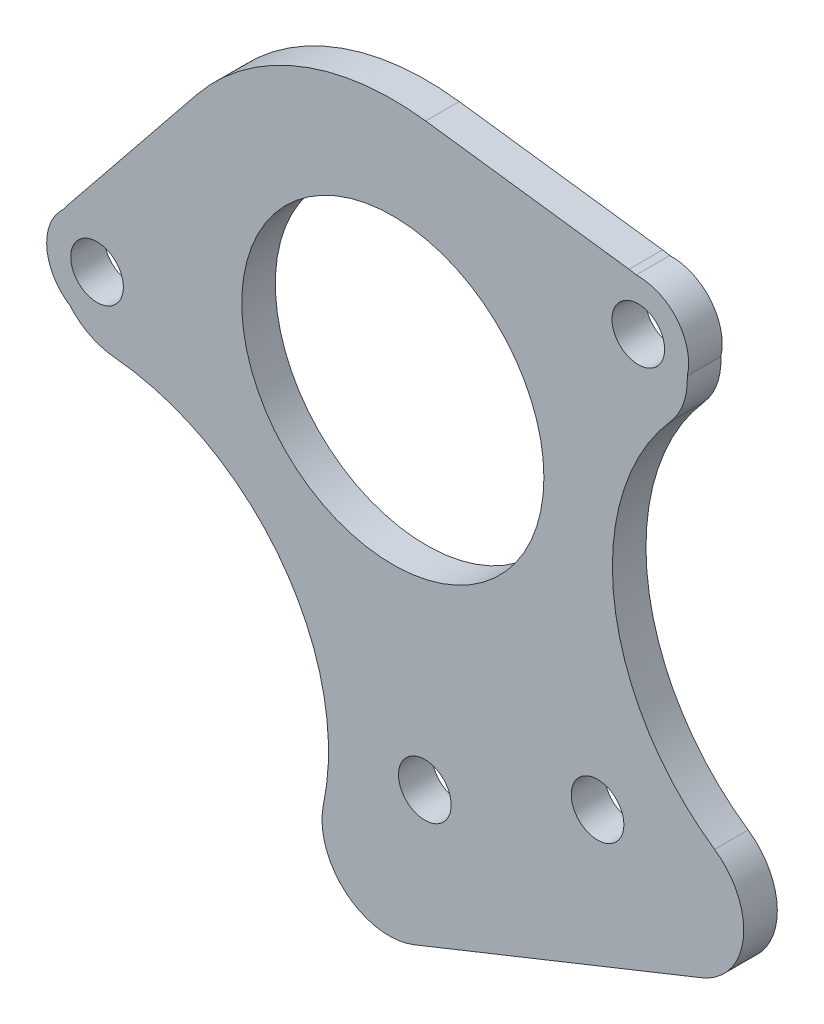
ISO-10303-21;
HEADER;
FILE_DESCRIPTION(('STEP AP214'),'2;1');
FILE_NAME('part.step','',(''),(''),'','','');
FILE_SCHEMA(('AUTOMOTIVE_DESIGN { 1 0 10303 214 1 1 1 1 }'));
ENDSEC;
DATA;
#1=APPLICATION_CONTEXT('core data for automotive mechanical design processes');
#2=APPLICATION_PROTOCOL_DEFINITION('international standard','automotive_design',2000,#1);
#3=PRODUCT_CONTEXT('',#1,'mechanical');
#4=PRODUCT('Part','Part','',(#3));
#5=PRODUCT_RELATED_PRODUCT_CATEGORY('part','',(#4));
#6=PRODUCT_DEFINITION_FORMATION('','',#4);
#7=PRODUCT_DEFINITION_CONTEXT('part definition',#1,'design');
#8=PRODUCT_DEFINITION('design','',#6,#7);
#9=PRODUCT_DEFINITION_SHAPE('','',#8);
#10=(LENGTH_UNIT() NAMED_UNIT(*) SI_UNIT(.MILLI.,.METRE.));
#11=(NAMED_UNIT(*) PLANE_ANGLE_UNIT() SI_UNIT($,.RADIAN.));
#12=(NAMED_UNIT(*) SI_UNIT($,.STERADIAN.) SOLID_ANGLE_UNIT());
#13=UNCERTAINTY_MEASURE_WITH_UNIT(LENGTH_MEASURE(1.E-05),#10,'distance_accuracy_value','');
#14=(GEOMETRIC_REPRESENTATION_CONTEXT(3) GLOBAL_UNCERTAINTY_ASSIGNED_CONTEXT((#13)) GLOBAL_UNIT_ASSIGNED_CONTEXT((#10,
#11,#12)) REPRESENTATION_CONTEXT('',''));
#15=CARTESIAN_POINT('',(0.,0.,0.));
#16=DIRECTION('',(0.,0.,1.));
#17=DIRECTION('',(1.,0.,0.));
#18=AXIS2_PLACEMENT_3D('',#15,#16,#17);
#19=CARTESIAN_POINT('',(239.222352264285,614.530885279437,3.175));
#20=DIRECTION('',(0.,0.,-1.));
#21=DIRECTION('',(-1.,0.,0.));
#22=AXIS2_PLACEMENT_3D('',#19,#20,#21);
#23=CYLINDRICAL_SURFACE('',#22,6.35);
#24=DIRECTION('',(0.,0.,1.));
#25=VECTOR('',#24,1.);
#26=CARTESIAN_POINT('',(233.869493700879,617.946936391493,1.5875));
#27=LINE('',#26,#25);
#28=CARTESIAN_POINT('',(233.869493700879,617.946936391493,3.175));
#29=VERTEX_POINT('',#28);
#30=CARTESIAN_POINT('',(233.869493700879,617.946936391493,0.));
#31=VERTEX_POINT('',#30);
#32=EDGE_CURVE('E11',#29,#31,#27,.F.);
#33=ORIENTED_EDGE('',*,*,#32,.F.);
#34=CARTESIAN_POINT('',(239.222352264285,614.530885279437,3.175));
#35=DIRECTION('',(0.,0.,1.));
#36=DIRECTION('',(1.,0.,0.));
#37=AXIS2_PLACEMENT_3D('',#34,#35,#36);
#38=CIRCLE('',#37,6.35);
#39=CARTESIAN_POINT('',(234.277101216712,618.514224591683,3.175));
#40=VERTEX_POINT('',#39);
#41=EDGE_CURVE('E172',#40,#29,#38,.T.);
#42=ORIENTED_EDGE('',*,*,#41,.F.);
#43=DIRECTION('',(0.,0.,1.));
#44=VECTOR('',#43,1.);
#45=CARTESIAN_POINT('',(234.277101216712,618.514224591683,3.175));
#46=LINE('',#45,#44);
#47=CARTESIAN_POINT('',(234.277101216712,618.514224591683,0.));
#48=VERTEX_POINT('',#47);
#49=EDGE_CURVE('E156',#48,#40,#46,.T.);
#50=ORIENTED_EDGE('',*,*,#49,.F.);
#51=CARTESIAN_POINT('',(239.222352264285,614.530885279437,0.));
#52=DIRECTION('',(0.,0.,1.));
#53=DIRECTION('',(1.,0.,0.));
#54=AXIS2_PLACEMENT_3D('',#51,#52,#53);
#55=CIRCLE('',#54,6.35);
#56=EDGE_CURVE('E157',#31,#48,#55,.F.);
#57=ORIENTED_EDGE('',*,*,#56,.F.);
#58=EDGE_LOOP('',(#33,#42,#50,#57));
#59=FACE_BOUND('',#58,.T.);
#60=ADVANCED_FACE('F39',(#59),#23,.T.);
#61=CARTESIAN_POINT('',(286.488706124676,633.463029384333,3.175));
#62=DIRECTION('',(0.,0.,-1.));
#63=DIRECTION('',(-1.,0.,0.));
#64=AXIS2_PLACEMENT_3D('',#61,#62,#63);
#65=CYLINDRICAL_SURFACE('',#64,6.35);
#66=DIRECTION('',(0.,0.,1.));
#67=VECTOR('',#66,1.);
#68=CARTESIAN_POINT('',(292.831348836054,633.768616419062,1.5875));
#69=LINE('',#68,#67);
#70=CARTESIAN_POINT('',(292.831348836054,633.768616419062,3.175));
#71=VERTEX_POINT('',#70);
#72=CARTESIAN_POINT('',(292.831348836054,633.768616419062,0.));
#73=VERTEX_POINT('',#72);
#74=EDGE_CURVE('E150',#71,#73,#69,.F.);
#75=ORIENTED_EDGE('',*,*,#74,.F.);
#76=CARTESIAN_POINT('',(286.488706124676,633.463029384333,3.175));
#77=DIRECTION('',(0.,0.,1.));
#78=DIRECTION('',(1.,0.,0.));
#79=AXIS2_PLACEMENT_3D('',#76,#77,#78);
#80=CIRCLE('',#79,6.35);
#81=CARTESIAN_POINT('',(291.263498924652,629.276879158015,3.175));
#82=VERTEX_POINT('',#81);
#83=EDGE_CURVE('E165',#82,#71,#80,.T.);
#84=ORIENTED_EDGE('',*,*,#83,.F.);
#85=DIRECTION('',(0.,0.,-1.));
#86=VECTOR('',#85,1.);
#87=CARTESIAN_POINT('',(291.263498924652,629.276879158015,3.175));
#88=LINE('',#87,#86);
#89=CARTESIAN_POINT('',(291.263498924652,629.276879158015,0.));
#90=VERTEX_POINT('',#89);
#91=EDGE_CURVE('E175',#90,#82,#88,.F.);
#92=ORIENTED_EDGE('',*,*,#91,.F.);
#93=CARTESIAN_POINT('',(286.488706124676,633.463029384333,0.));
#94=DIRECTION('',(0.,0.,1.));
#95=DIRECTION('',(1.,0.,0.));
#96=AXIS2_PLACEMENT_3D('',#93,#94,#95);
#97=CIRCLE('',#96,6.35);
#98=EDGE_CURVE('E200',#73,#90,#97,.F.);
#99=ORIENTED_EDGE('',*,*,#98,.F.);
#100=EDGE_LOOP('',(#75,#84,#92,#99));
#101=FACE_BOUND('',#100,.T.);
#102=ADVANCED_FACE('F201',(#101),#65,.T.);
#103=CARTESIAN_POINT('',(236.681188921527,586.069101887221,3.175));
#104=DIRECTION('',(0.,0.,-1.));
#105=DIRECTION('',(-1.,0.,0.));
#106=AXIS2_PLACEMENT_3D('',#103,#104,#105);
#107=CYLINDRICAL_SURFACE('',#106,22.225);
#108=CARTESIAN_POINT('',(236.681188921527,586.069101887221,3.175));
#109=DIRECTION('',(0.,0.,1.));
#110=DIRECTION('',(1.,0.,0.));
#111=AXIS2_PLACEMENT_3D('',#108,#109,#110);
#112=CIRCLE('',#111,22.225);
#113=CARTESIAN_POINT('',(258.426883586808,581.478307998974,3.175));
#114=VERTEX_POINT('',#113);
#115=CARTESIAN_POINT('',(238.657649299227,608.206044525611,3.175));
#116=VERTEX_POINT('',#115);
#117=EDGE_CURVE('E240',#114,#116,#112,.T.);
#118=ORIENTED_EDGE('',*,*,#117,.T.);
#119=DIRECTION('',(0.,0.,-1.));
#120=VECTOR('',#119,1.);
#121=CARTESIAN_POINT('',(238.657649299227,608.206044525611,3.175));
#122=LINE('',#121,#120);
#123=CARTESIAN_POINT('',(238.657649299227,608.206044525611,0.));
#124=VERTEX_POINT('',#123);
#125=EDGE_CURVE('E205',#116,#124,#122,.T.);
#126=ORIENTED_EDGE('',*,*,#125,.T.);
#127=CARTESIAN_POINT('',(236.681188921527,586.069101887221,0.));
#128=DIRECTION('',(0.,0.,1.));
#129=DIRECTION('',(1.,0.,0.));
#130=AXIS2_PLACEMENT_3D('',#127,#128,#129);
#131=CIRCLE('',#130,22.225);
#132=CARTESIAN_POINT('',(258.426883586808,581.478307998974,0.));
#133=VERTEX_POINT('',#132);
#134=EDGE_CURVE('E155',#133,#124,#131,.T.);
#135=ORIENTED_EDGE('',*,*,#134,.F.);
#136=DIRECTION('',(0.,0.,-1.));
#137=VECTOR('',#136,1.);
#138=CARTESIAN_POINT('',(258.426883586808,581.478307998974,3.175));
#139=LINE('',#138,#137);
#140=EDGE_CURVE('E208',#133,#114,#139,.F.);
#141=ORIENTED_EDGE('',*,*,#140,.T.);
#142=EDGE_LOOP('',(#118,#126,#135,#141));
#143=FACE_BOUND('',#142,.T.);
#144=ADVANCED_FACE('F296',(#143),#107,.F.);
#145=CARTESIAN_POINT('',(-161.305125926608,402.717469257513,3.175));
#146=DIRECTION('',(-0.371824109987117,0.928303200054965,0.));
#147=DIRECTION('',(-0.928303200054965,-0.371824109987117,0.));
#148=AXIS2_PLACEMENT_3D('',#145,#146,#147);
#149=PLANE('',#148);
#150=DIRECTION('',(0.928303200054965,0.371824109987117,0.));
#151=VECTOR('',#150,1.);
#152=CARTESIAN_POINT('',(-161.305125926608,402.717469257513,0.));
#153=LINE('',#152,#151);
#154=CARTESIAN_POINT('',(267.001022303878,574.271927281983,0.));
#155=VERTEX_POINT('',#154);
#156=CARTESIAN_POINT('',(294.183022031145,585.159450728701,0.));
#157=VERTEX_POINT('',#156);
#158=EDGE_CURVE('E213',#155,#157,#153,.T.);
#159=ORIENTED_EDGE('',*,*,#158,.T.);
#160=DIRECTION('',(0.,0.,1.));
#161=VECTOR('',#160,1.);
#162=CARTESIAN_POINT('',(294.183022031145,585.159450728701,3.175));
#163=LINE('',#162,#161);
#164=CARTESIAN_POINT('',(294.183022031145,585.159450728701,3.175));
#165=VERTEX_POINT('',#164);
#166=EDGE_CURVE('E183',#157,#165,#163,.T.);
#167=ORIENTED_EDGE('',*,*,#166,.T.);
#168=DIRECTION('',(0.928303200054965,0.371824109987117,0.));
#169=VECTOR('',#168,1.);
#170=CARTESIAN_POINT('',(-161.305125926608,402.717469257513,3.175));
#171=LINE('',#170,#169);
#172=CARTESIAN_POINT('',(267.001022303878,574.271927281983,3.175));
#173=VERTEX_POINT('',#172);
#174=EDGE_CURVE('E232',#173,#165,#171,.T.);
#175=ORIENTED_EDGE('',*,*,#174,.F.);
#176=DIRECTION('',(0.,0.,1.));
#177=VECTOR('',#176,1.);
#178=CARTESIAN_POINT('',(267.001022303878,574.271927281983,0.));
#179=LINE('',#178,#177);
#180=EDGE_CURVE('E180',#173,#155,#179,.F.);
#181=ORIENTED_EDGE('',*,*,#180,.T.);
#182=EDGE_LOOP('',(#159,#167,#175,#181));
#183=FACE_BOUND('',#182,.T.);
#184=ADVANCED_FACE('F219',(#183),#149,.F.);
#185=CARTESIAN_POINT('',(307.975273724569,614.625353365906,3.175));
#186=DIRECTION('',(0.,0.,-1.));
#187=DIRECTION('',(-1.,0.,0.));
#188=AXIS2_PLACEMENT_3D('',#185,#186,#187);
#189=CYLINDRICAL_SURFACE('',#188,22.225);
#190=CARTESIAN_POINT('',(307.975273724569,614.625353365906,3.175));
#191=DIRECTION('',(0.,0.,1.));
#192=DIRECTION('',(1.,0.,0.));
#193=AXIS2_PLACEMENT_3D('',#190,#191,#192);
#194=CIRCLE('',#193,22.225);
#195=CARTESIAN_POINT('',(295.41156888647,596.292215452795,3.175));
#196=VERTEX_POINT('',#195);
#197=EDGE_CURVE('E231',#82,#196,#194,.T.);
#198=ORIENTED_EDGE('',*,*,#197,.T.);
#199=DIRECTION('',(0.,0.,-1.));
#200=VECTOR('',#199,1.);
#201=CARTESIAN_POINT('',(295.41156888647,596.292215452795,3.175));
#202=LINE('',#201,#200);
#203=CARTESIAN_POINT('',(295.41156888647,596.292215452795,0.));
#204=VERTEX_POINT('',#203);
#205=EDGE_CURVE('E177',#196,#204,#202,.T.);
#206=ORIENTED_EDGE('',*,*,#205,.T.);
#207=CARTESIAN_POINT('',(307.975273724569,614.625353365906,0.));
#208=DIRECTION('',(0.,0.,1.));
#209=DIRECTION('',(1.,0.,0.));
#210=AXIS2_PLACEMENT_3D('',#207,#208,#209);
#211=CIRCLE('',#210,22.225);
#212=EDGE_CURVE('E214',#90,#204,#211,.T.);
#213=ORIENTED_EDGE('',*,*,#212,.F.);
#214=ORIENTED_EDGE('',*,*,#91,.T.);
#215=EDGE_LOOP('',(#198,#206,#213,#214));
#216=FACE_BOUND('',#215,.T.);
#217=ADVANCED_FACE('F234',(#216),#189,.F.);
#218=CARTESIAN_POINT('',(87.5972657903765,666.026359261334,3.175));
#219=DIRECTION('',(0.130399227174235,0.991461568368821,0.));
#220=DIRECTION('',(-0.991461568368821,0.130399227174235,0.));
#221=AXIS2_PLACEMENT_3D('',#218,#219,#220);
#222=PLANE('',#221);
#223=DIRECTION('',(0.991461568368821,-0.130399227174235,0.));
#224=VECTOR('',#223,1.);
#225=CARTESIAN_POINT('',(87.5972657903765,666.026359261334,3.175));
#226=LINE('',#225,#224);
#227=CARTESIAN_POINT('',(268.091028626586,642.287418757232,3.175));
#228=VERTEX_POINT('',#227);
#229=CARTESIAN_POINT('',(287.316741217232,639.758810343474,3.175));
#230=VERTEX_POINT('',#229);
#231=EDGE_CURVE('E235',#228,#230,#226,.T.);
#232=ORIENTED_EDGE('',*,*,#231,.T.);
#233=DIRECTION('',(0.,0.,-1.));
#234=VECTOR('',#233,1.);
#235=CARTESIAN_POINT('',(287.316741217232,639.758810343474,3.175));
#236=LINE('',#235,#234);
#237=CARTESIAN_POINT('',(287.316741217232,639.758810343474,0.));
#238=VERTEX_POINT('',#237);
#239=EDGE_CURVE('E185',#230,#238,#236,.T.);
#240=ORIENTED_EDGE('',*,*,#239,.T.);
#241=DIRECTION('',(0.991461568368821,-0.130399227174235,0.));
#242=VECTOR('',#241,1.);
#243=CARTESIAN_POINT('',(87.5972657903765,666.026359261334,0.));
#244=LINE('',#243,#242);
#245=CARTESIAN_POINT('',(268.091028626586,642.287418757232,0.));
#246=VERTEX_POINT('',#245);
#247=EDGE_CURVE('E267',#246,#238,#244,.T.);
#248=ORIENTED_EDGE('',*,*,#247,.F.);
#249=DIRECTION('',(0.,0.,-1.));
#250=VECTOR('',#249,1.);
#251=CARTESIAN_POINT('',(268.091028626586,642.287418757232,3.175));
#252=LINE('',#251,#250);
#253=EDGE_CURVE('E291',#228,#246,#252,.T.);
#254=ORIENTED_EDGE('',*,*,#253,.F.);
#255=EDGE_LOOP('',(#232,#240,#248,#254));
#256=FACE_BOUND('',#255,.T.);
#257=ADVANCED_FACE('F349',(#256),#222,.T.);
#258=CARTESIAN_POINT('',(264.985897029499,618.678240160449,3.175));
#259=DIRECTION('',(0.,0.,-1.));
#260=DIRECTION('',(-1.,0.,0.));
#261=AXIS2_PLACEMENT_3D('',#258,#259,#260);
#262=CYLINDRICAL_SURFACE('',#261,23.8125);
#263=CARTESIAN_POINT('',(264.985897029499,618.678240160449,0.));
#264=DIRECTION('',(0.,0.,1.));
#265=DIRECTION('',(1.,0.,0.));
#266=AXIS2_PLACEMENT_3D('',#263,#264,#265);
#267=CIRCLE('',#266,23.8125);
#268=CARTESIAN_POINT('',(246.441205601101,633.615762581369,0.));
#269=VERTEX_POINT('',#268);
#270=EDGE_CURVE('E270',#246,#269,#267,.T.);
#271=ORIENTED_EDGE('',*,*,#270,.T.);
#272=DIRECTION('',(0.,0.,-1.));
#273=VECTOR('',#272,1.);
#274=CARTESIAN_POINT('',(246.441205601101,633.615762581369,3.175));
#275=LINE('',#274,#273);
#276=CARTESIAN_POINT('',(246.441205601101,633.615762581369,3.175));
#277=VERTEX_POINT('',#276);
#278=EDGE_CURVE('E261',#277,#269,#275,.T.);
#279=ORIENTED_EDGE('',*,*,#278,.F.);
#280=CARTESIAN_POINT('',(264.985897029499,618.678240160449,3.175));
#281=DIRECTION('',(0.,0.,1.));
#282=DIRECTION('',(1.,0.,0.));
#283=AXIS2_PLACEMENT_3D('',#280,#281,#282);
#284=CIRCLE('',#283,23.8125);
#285=EDGE_CURVE('E238',#228,#277,#284,.T.);
#286=ORIENTED_EDGE('',*,*,#285,.F.);
#287=ORIENTED_EDGE('',*,*,#253,.T.);
#288=EDGE_LOOP('',(#271,#279,#286,#287));
#289=FACE_BOUND('',#288,.T.);
#290=ADVANCED_FACE('F334',(#289),#262,.T.);
#291=CARTESIAN_POINT('',(284.34570985327,594.006957975245,3.175));
#292=DIRECTION('',(0.,0.,-1.));
#293=DIRECTION('',(-1.,0.,0.));
#294=AXIS2_PLACEMENT_3D('',#291,#292,#293);
#295=CYLINDRICAL_SURFACE('',#294,2.48919999999994);
#296=CARTESIAN_POINT('',(284.34570985327,594.006957975245,3.175));
#297=DIRECTION('',(0.,0.,1.));
#298=DIRECTION('',(1.,0.,0.));
#299=AXIS2_PLACEMENT_3D('',#296,#297,#298);
#300=CIRCLE('',#299,2.48919999999994);
#301=CARTESIAN_POINT('',(286.83490985327,594.006957975245,3.175));
#302=VERTEX_POINT('',#301);
#303=EDGE_CURVE('E255',#302,#302,#300,.T.);
#304=ORIENTED_EDGE('',*,*,#303,.T.);
#305=EDGE_LOOP('',(#304));
#306=FACE_BOUND('',#305,.T.);
#307=CARTESIAN_POINT('',(284.34570985327,594.006957975245,0.));
#308=DIRECTION('',(0.,0.,1.));
#309=DIRECTION('',(1.,0.,0.));
#310=AXIS2_PLACEMENT_3D('',#307,#308,#309);
#311=CIRCLE('',#310,2.48919999999994);
#312=CARTESIAN_POINT('',(286.83490985327,594.006957975245,0.));
#313=VERTEX_POINT('',#312);
#314=EDGE_CURVE('E282',#313,#313,#311,.T.);
#315=ORIENTED_EDGE('',*,*,#314,.F.);
#316=EDGE_LOOP('',(#315));
#317=FACE_BOUND('',#316,.T.);
#318=ADVANCED_FACE('F330',(#306,#317),#295,.F.);
#319=CARTESIAN_POINT('',(268.01054659779,587.464044476074,3.175));
#320=DIRECTION('',(0.,0.,-1.));
#321=DIRECTION('',(-1.,0.,0.));
#322=AXIS2_PLACEMENT_3D('',#319,#320,#321);
#323=CYLINDRICAL_SURFACE('',#322,2.48919999999999);
#324=CARTESIAN_POINT('',(268.01054659779,587.464044476074,3.175));
#325=DIRECTION('',(0.,0.,1.));
#326=DIRECTION('',(1.,0.,0.));
#327=AXIS2_PLACEMENT_3D('',#324,#325,#326);
#328=CIRCLE('',#327,2.48919999999999);
#329=CARTESIAN_POINT('',(270.49974659779,587.464044476074,3.175));
#330=VERTEX_POINT('',#329);
#331=EDGE_CURVE('E252',#330,#330,#328,.T.);
#332=ORIENTED_EDGE('',*,*,#331,.T.);
#333=EDGE_LOOP('',(#332));
#334=FACE_BOUND('',#333,.T.);
#335=CARTESIAN_POINT('',(268.01054659779,587.464044476074,0.));
#336=DIRECTION('',(0.,0.,1.));
#337=DIRECTION('',(1.,0.,0.));
#338=AXIS2_PLACEMENT_3D('',#335,#336,#337);
#339=CIRCLE('',#338,2.48919999999999);
#340=CARTESIAN_POINT('',(270.49974659779,587.464044476074,0.));
#341=VERTEX_POINT('',#340);
#342=EDGE_CURVE('E279',#341,#341,#339,.T.);
#343=ORIENTED_EDGE('',*,*,#342,.F.);
#344=EDGE_LOOP('',(#343));
#345=FACE_BOUND('',#344,.T.);
#346=ADVANCED_FACE('F333',(#334,#345),#323,.F.);
#347=CARTESIAN_POINT('',(264.985897029499,618.678240160449,3.175));
#348=DIRECTION('',(0.,0.,-1.));
#349=DIRECTION('',(-1.,0.,0.));
#350=AXIS2_PLACEMENT_3D('',#347,#348,#349);
#351=CYLINDRICAL_SURFACE('',#350,14.2875000000001);
#352=CARTESIAN_POINT('',(264.985897029499,618.678240160449,3.175));
#353=DIRECTION('',(0.,0.,1.));
#354=DIRECTION('',(1.,0.,0.));
#355=AXIS2_PLACEMENT_3D('',#352,#353,#354);
#356=CIRCLE('',#355,14.2875000000001);
#357=CARTESIAN_POINT('',(279.273397029499,618.678240160449,3.175));
#358=VERTEX_POINT('',#357);
#359=EDGE_CURVE('E249',#358,#358,#356,.T.);
#360=ORIENTED_EDGE('',*,*,#359,.T.);
#361=EDGE_LOOP('',(#360));
#362=FACE_BOUND('',#361,.T.);
#363=CARTESIAN_POINT('',(264.985897029499,618.678240160449,0.));
#364=DIRECTION('',(0.,0.,1.));
#365=DIRECTION('',(1.,0.,0.));
#366=AXIS2_PLACEMENT_3D('',#363,#364,#365);
#367=CIRCLE('',#366,14.2875000000001);
#368=CARTESIAN_POINT('',(279.273397029499,618.678240160449,0.));
#369=VERTEX_POINT('',#368);
#370=EDGE_CURVE('E276',#369,#369,#367,.T.);
#371=ORIENTED_EDGE('',*,*,#370,.F.);
#372=EDGE_LOOP('',(#371));
#373=FACE_BOUND('',#372,.T.);
#374=ADVANCED_FACE('F338',(#362,#373),#351,.F.);
#375=CARTESIAN_POINT('',(-160.072088348358,128.936111873264,3.175));
#376=DIRECTION('',(0.77877969253116,-0.62729752948746,0.));
#377=DIRECTION('',(0.627297529487461,0.778779692531161,0.));
#378=AXIS2_PLACEMENT_3D('',#375,#376,#377);
#379=PLANE('',#378);
#380=DIRECTION('',(-0.627297529487461,-0.77877969253116,0.));
#381=VECTOR('',#380,1.);
#382=CARTESIAN_POINT('',(-160.072088348358,128.936111873264,0.));
#383=LINE('',#382,#381);
#384=EDGE_CURVE('E273',#269,#48,#383,.T.);
#385=ORIENTED_EDGE('',*,*,#384,.T.);
#386=ORIENTED_EDGE('',*,*,#49,.T.);
#387=DIRECTION('',(-0.627297529487461,-0.77877969253116,0.));
#388=VECTOR('',#387,1.);
#389=CARTESIAN_POINT('',(-160.072088348358,128.936111873264,3.175));
#390=LINE('',#389,#388);
#391=EDGE_CURVE('E246',#277,#40,#390,.T.);
#392=ORIENTED_EDGE('',*,*,#391,.F.);
#393=ORIENTED_EDGE('',*,*,#278,.T.);
#394=EDGE_LOOP('',(#385,#386,#392,#393));
#395=FACE_BOUND('',#394,.T.);
#396=ADVANCED_FACE('F342',(#395),#379,.F.);
#397=CARTESIAN_POINT('',(237.013362410774,614.369577619306,3.175));
#398=DIRECTION('',(0.,0.,-1.));
#399=DIRECTION('',(-1.,0.,0.));
#400=AXIS2_PLACEMENT_3D('',#397,#398,#399);
#401=CYLINDRICAL_SURFACE('',#400,2.48919999999994);
#402=CARTESIAN_POINT('',(237.013362410774,614.369577619306,3.175));
#403=DIRECTION('',(0.,0.,1.));
#404=DIRECTION('',(1.,0.,0.));
#405=AXIS2_PLACEMENT_3D('',#402,#403,#404);
#406=CIRCLE('',#405,2.48919999999994);
#407=CARTESIAN_POINT('',(239.502562410774,614.369577619306,3.175));
#408=VERTEX_POINT('',#407);
#409=EDGE_CURVE('E288',#408,#408,#406,.T.);
#410=ORIENTED_EDGE('',*,*,#409,.T.);
#411=EDGE_LOOP('',(#410));
#412=FACE_BOUND('',#411,.T.);
#413=CARTESIAN_POINT('',(237.013362410774,614.369577619306,0.));
#414=DIRECTION('',(0.,0.,1.));
#415=DIRECTION('',(1.,0.,0.));
#416=AXIS2_PLACEMENT_3D('',#413,#414,#415);
#417=CIRCLE('',#416,2.48919999999994);
#418=CARTESIAN_POINT('',(239.502562410774,614.369577619306,0.));
#419=VERTEX_POINT('',#418);
#420=EDGE_CURVE('E262',#419,#419,#417,.T.);
#421=ORIENTED_EDGE('',*,*,#420,.F.);
#422=EDGE_LOOP('',(#421));
#423=FACE_BOUND('',#422,.T.);
#424=ADVANCED_FACE('F328',(#412,#423),#401,.F.);
#425=CARTESIAN_POINT('',(288.198251966065,634.871258538382,3.175));
#426=DIRECTION('',(0.,0.,-1.));
#427=DIRECTION('',(-1.,0.,0.));
#428=AXIS2_PLACEMENT_3D('',#425,#426,#427);
#429=CYLINDRICAL_SURFACE('',#428,2.48920000000004);
#430=CARTESIAN_POINT('',(288.198251966065,634.871258538382,3.175));
#431=DIRECTION('',(0.,0.,1.));
#432=DIRECTION('',(1.,0.,0.));
#433=AXIS2_PLACEMENT_3D('',#430,#431,#432);
#434=CIRCLE('',#433,2.48920000000004);
#435=CARTESIAN_POINT('',(290.687451966065,634.871258538382,3.175));
#436=VERTEX_POINT('',#435);
#437=EDGE_CURVE('E258',#436,#436,#434,.T.);
#438=ORIENTED_EDGE('',*,*,#437,.T.);
#439=EDGE_LOOP('',(#438));
#440=FACE_BOUND('',#439,.T.);
#441=CARTESIAN_POINT('',(288.198251966065,634.871258538382,0.));
#442=DIRECTION('',(0.,0.,1.));
#443=DIRECTION('',(1.,0.,0.));
#444=AXIS2_PLACEMENT_3D('',#441,#442,#443);
#445=CIRCLE('',#444,2.48920000000004);
#446=CARTESIAN_POINT('',(290.687451966065,634.871258538382,0.));
#447=VERTEX_POINT('',#446);
#448=EDGE_CURVE('E285',#447,#447,#445,.T.);
#449=ORIENTED_EDGE('',*,*,#448,.F.);
#450=EDGE_LOOP('',(#449));
#451=FACE_BOUND('',#450,.T.);
#452=ADVANCED_FACE('F322',(#440,#451),#429,.F.);
#453=CARTESIAN_POINT('',(0.,0.,3.175));
#454=DIRECTION('',(0.,0.,1.));
#455=DIRECTION('',(1.,0.,0.));
#456=AXIS2_PLACEMENT_3D('',#453,#454,#455);
#457=PLANE('',#456);
#458=ORIENTED_EDGE('',*,*,#41,.T.);
#459=CARTESIAN_POINT('',(237.013362410774,614.369577619306,3.175));
#460=DIRECTION('',(0.,0.,1.));
#461=DIRECTION('',(1.,0.,0.));
#462=AXIS2_PLACEMENT_3D('',#459,#460,#461);
#463=CIRCLE('',#462,4.76250000000003);
#464=CARTESIAN_POINT('',(234.422534249233,610.373452535257,3.175));
#465=VERTEX_POINT('',#464);
#466=EDGE_CURVE('E141',#29,#465,#463,.T.);
#467=ORIENTED_EDGE('',*,*,#466,.T.);
#468=EDGE_CURVE('E149',#465,#116,#38,.T.);
#469=ORIENTED_EDGE('',*,*,#468,.T.);
#470=ORIENTED_EDGE('',*,*,#117,.F.);
#471=CARTESIAN_POINT('',(264.63993920546,580.166652602332,3.175));
#472=DIRECTION('',(0.,0.,1.));
#473=DIRECTION('',(1.,0.,0.));
#474=AXIS2_PLACEMENT_3D('',#471,#472,#473);
#475=CIRCLE('',#474,6.35);
#476=EDGE_CURVE('E168',#114,#173,#475,.T.);
#477=ORIENTED_EDGE('',*,*,#476,.T.);
#478=ORIENTED_EDGE('',*,*,#174,.T.);
#479=CARTESIAN_POINT('',(291.821938932727,591.05417604905,3.175));
#480=DIRECTION('',(0.,0.,1.));
#481=DIRECTION('',(1.,0.,0.));
#482=AXIS2_PLACEMENT_3D('',#479,#480,#481);
#483=CIRCLE('',#482,6.35);
#484=EDGE_CURVE('E170',#165,#196,#483,.T.);
#485=ORIENTED_EDGE('',*,*,#484,.T.);
#486=ORIENTED_EDGE('',*,*,#197,.F.);
#487=ORIENTED_EDGE('',*,*,#83,.T.);
#488=CARTESIAN_POINT('',(288.198251966066,634.871258538382,3.175));
#489=DIRECTION('',(0.,0.,1.));
#490=DIRECTION('',(1.,0.,0.));
#491=AXIS2_PLACEMENT_3D('',#488,#489,#490);
#492=CIRCLE('',#491,4.76250000000003);
#493=CARTESIAN_POINT('',(288.003259314898,639.629765038955,3.175));
#494=VERTEX_POINT('',#493);
#495=EDGE_CURVE('E196',#71,#494,#492,.T.);
#496=ORIENTED_EDGE('',*,*,#495,.T.);
#497=EDGE_CURVE('E159',#494,#230,#80,.T.);
#498=ORIENTED_EDGE('',*,*,#497,.T.);
#499=ORIENTED_EDGE('',*,*,#231,.F.);
#500=ORIENTED_EDGE('',*,*,#285,.T.);
#501=ORIENTED_EDGE('',*,*,#391,.T.);
#502=EDGE_LOOP('',(#458,#467,#469,#470,#477,#478,#485,#486,#487,#496,#498,#499,#500,#501));
#503=FACE_BOUND('',#502,.T.);
#504=ORIENTED_EDGE('',*,*,#359,.F.);
#505=EDGE_LOOP('',(#504));
#506=FACE_BOUND('',#505,.T.);
#507=ORIENTED_EDGE('',*,*,#331,.F.);
#508=EDGE_LOOP('',(#507));
#509=FACE_BOUND('',#508,.T.);
#510=ORIENTED_EDGE('',*,*,#303,.F.);
#511=EDGE_LOOP('',(#510));
#512=FACE_BOUND('',#511,.T.);
#513=ORIENTED_EDGE('',*,*,#437,.F.);
#514=EDGE_LOOP('',(#513));
#515=FACE_BOUND('',#514,.T.);
#516=ORIENTED_EDGE('',*,*,#409,.F.);
#517=EDGE_LOOP('',(#516));
#518=FACE_BOUND('',#517,.T.);
#519=ADVANCED_FACE('F229',(#503,#506,#509,#512,#515,#518),#457,.T.);
#520=CARTESIAN_POINT('',(0.,0.,0.));
#521=DIRECTION('',(0.,0.,1.));
#522=DIRECTION('',(1.,0.,0.));
#523=AXIS2_PLACEMENT_3D('',#520,#521,#522);
#524=PLANE('',#523);
#525=CARTESIAN_POINT('',(234.422534249233,610.373452535257,0.));
#526=VERTEX_POINT('',#525);
#527=EDGE_CURVE('E147',#124,#526,#55,.F.);
#528=ORIENTED_EDGE('',*,*,#527,.T.);
#529=CARTESIAN_POINT('',(237.013362410774,614.369577619306,0.));
#530=DIRECTION('',(0.,0.,1.));
#531=DIRECTION('',(1.,0.,0.));
#532=AXIS2_PLACEMENT_3D('',#529,#530,#531);
#533=CIRCLE('',#532,4.76250000000003);
#534=EDGE_CURVE('E54',#526,#31,#533,.F.);
#535=ORIENTED_EDGE('',*,*,#534,.T.);
#536=ORIENTED_EDGE('',*,*,#56,.T.);
#537=ORIENTED_EDGE('',*,*,#384,.F.);
#538=ORIENTED_EDGE('',*,*,#270,.F.);
#539=ORIENTED_EDGE('',*,*,#247,.T.);
#540=CARTESIAN_POINT('',(288.003259314898,639.629765038955,0.));
#541=VERTEX_POINT('',#540);
#542=EDGE_CURVE('E204',#238,#541,#97,.F.);
#543=ORIENTED_EDGE('',*,*,#542,.T.);
#544=CARTESIAN_POINT('',(288.198251966066,634.871258538382,0.));
#545=DIRECTION('',(0.,0.,1.));
#546=DIRECTION('',(1.,0.,0.));
#547=AXIS2_PLACEMENT_3D('',#544,#545,#546);
#548=CIRCLE('',#547,4.76250000000003);
#549=EDGE_CURVE('E60',#541,#73,#548,.F.);
#550=ORIENTED_EDGE('',*,*,#549,.T.);
#551=ORIENTED_EDGE('',*,*,#98,.T.);
#552=ORIENTED_EDGE('',*,*,#212,.T.);
#553=CARTESIAN_POINT('',(291.821938932727,591.05417604905,0.));
#554=DIRECTION('',(0.,0.,1.));
#555=DIRECTION('',(1.,0.,0.));
#556=AXIS2_PLACEMENT_3D('',#553,#554,#555);
#557=CIRCLE('',#556,6.35);
#558=EDGE_CURVE('E161',#204,#157,#557,.F.);
#559=ORIENTED_EDGE('',*,*,#558,.T.);
#560=ORIENTED_EDGE('',*,*,#158,.F.);
#561=CARTESIAN_POINT('',(264.63993920546,580.166652602332,0.));
#562=DIRECTION('',(0.,0.,1.));
#563=DIRECTION('',(1.,0.,0.));
#564=AXIS2_PLACEMENT_3D('',#561,#562,#563);
#565=CIRCLE('',#564,6.35);
#566=EDGE_CURVE('E207',#155,#133,#565,.F.);
#567=ORIENTED_EDGE('',*,*,#566,.T.);
#568=ORIENTED_EDGE('',*,*,#134,.T.);
#569=EDGE_LOOP('',(#528,#535,#536,#537,#538,#539,#543,#550,#551,#552,#559,#560,#567,#568));
#570=FACE_BOUND('',#569,.T.);
#571=ORIENTED_EDGE('',*,*,#370,.T.);
#572=EDGE_LOOP('',(#571));
#573=FACE_BOUND('',#572,.T.);
#574=ORIENTED_EDGE('',*,*,#342,.T.);
#575=EDGE_LOOP('',(#574));
#576=FACE_BOUND('',#575,.T.);
#577=ORIENTED_EDGE('',*,*,#314,.T.);
#578=EDGE_LOOP('',(#577));
#579=FACE_BOUND('',#578,.T.);
#580=ORIENTED_EDGE('',*,*,#448,.T.);
#581=EDGE_LOOP('',(#580));
#582=FACE_BOUND('',#581,.T.);
#583=ORIENTED_EDGE('',*,*,#420,.T.);
#584=EDGE_LOOP('',(#583));
#585=FACE_BOUND('',#584,.T.);
#586=ADVANCED_FACE('F152',(#570,#573,#576,#579,#582,#585),#524,.F.);
#587=DIRECTION('',(0.,0.,1.));
#588=VECTOR('',#587,1.);
#589=CARTESIAN_POINT('',(234.422534249233,610.373452535257,1.5875));
#590=LINE('',#589,#588);
#591=EDGE_CURVE('E47',#526,#465,#590,.T.);
#592=ORIENTED_EDGE('',*,*,#591,.F.);
#593=ORIENTED_EDGE('',*,*,#527,.F.);
#594=ORIENTED_EDGE('',*,*,#125,.F.);
#595=ORIENTED_EDGE('',*,*,#468,.F.);
#596=EDGE_LOOP('',(#592,#593,#594,#595));
#597=FACE_BOUND('',#596,.T.);
#598=ADVANCED_FACE('F145',(#597),#23,.T.);
#599=CARTESIAN_POINT('',(291.821938932727,591.05417604905,3.175));
#600=DIRECTION('',(0.,0.,-1.));
#601=DIRECTION('',(-1.,0.,0.));
#602=AXIS2_PLACEMENT_3D('',#599,#600,#601);
#603=CYLINDRICAL_SURFACE('',#602,6.35);
#604=ORIENTED_EDGE('',*,*,#484,.F.);
#605=ORIENTED_EDGE('',*,*,#166,.F.);
#606=ORIENTED_EDGE('',*,*,#558,.F.);
#607=ORIENTED_EDGE('',*,*,#205,.F.);
#608=EDGE_LOOP('',(#604,#605,#606,#607));
#609=FACE_BOUND('',#608,.T.);
#610=ADVANCED_FACE('F225',(#609),#603,.T.);
#611=CARTESIAN_POINT('',(264.63993920546,580.166652602332,3.175));
#612=DIRECTION('',(0.,0.,-1.));
#613=DIRECTION('',(-1.,0.,0.));
#614=AXIS2_PLACEMENT_3D('',#611,#612,#613);
#615=CYLINDRICAL_SURFACE('',#614,6.35);
#616=ORIENTED_EDGE('',*,*,#476,.F.);
#617=ORIENTED_EDGE('',*,*,#140,.F.);
#618=ORIENTED_EDGE('',*,*,#566,.F.);
#619=ORIENTED_EDGE('',*,*,#180,.F.);
#620=EDGE_LOOP('',(#616,#617,#618,#619));
#621=FACE_BOUND('',#620,.T.);
#622=ADVANCED_FACE('F299',(#621),#615,.T.);
#623=DIRECTION('',(0.,0.,1.));
#624=VECTOR('',#623,1.);
#625=CARTESIAN_POINT('',(288.003259314898,639.629765038955,1.5875));
#626=LINE('',#625,#624);
#627=EDGE_CURVE('E188',#541,#494,#626,.T.);
#628=ORIENTED_EDGE('',*,*,#627,.F.);
#629=ORIENTED_EDGE('',*,*,#542,.F.);
#630=ORIENTED_EDGE('',*,*,#239,.F.);
#631=ORIENTED_EDGE('',*,*,#497,.F.);
#632=EDGE_LOOP('',(#628,#629,#630,#631));
#633=FACE_BOUND('',#632,.T.);
#634=ADVANCED_FACE('F41',(#633),#65,.T.);
#635=CARTESIAN_POINT('',(288.198251966066,634.871258538382,-13.4703841816038));
#636=DIRECTION('',(0.,0.,1.));
#637=DIRECTION('',(1.,0.,0.));
#638=AXIS2_PLACEMENT_3D('',#635,#636,#637);
#639=CYLINDRICAL_SURFACE('',#638,4.76250000000003);
#640=ORIENTED_EDGE('',*,*,#495,.F.);
#641=ORIENTED_EDGE('',*,*,#74,.T.);
#642=ORIENTED_EDGE('',*,*,#549,.F.);
#643=ORIENTED_EDGE('',*,*,#627,.T.);
#644=EDGE_LOOP('',(#640,#641,#642,#643));
#645=FACE_BOUND('',#644,.T.);
#646=ADVANCED_FACE('F193',(#645),#639,.T.);
#647=CARTESIAN_POINT('',(237.013362410774,614.369577619306,-13.4703841816038));
#648=DIRECTION('',(0.,0.,1.));
#649=DIRECTION('',(1.,0.,0.));
#650=AXIS2_PLACEMENT_3D('',#647,#648,#649);
#651=CYLINDRICAL_SURFACE('',#650,4.76250000000003);
#652=ORIENTED_EDGE('',*,*,#466,.F.);
#653=ORIENTED_EDGE('',*,*,#32,.T.);
#654=ORIENTED_EDGE('',*,*,#534,.F.);
#655=ORIENTED_EDGE('',*,*,#591,.T.);
#656=EDGE_LOOP('',(#652,#653,#654,#655));
#657=FACE_BOUND('',#656,.T.);
#658=ADVANCED_FACE('F137',(#657),#651,.T.);
#659=CLOSED_SHELL('',(#60,#102,#144,#184,#217,#257,#290,#318,#346,#374,#396,#424,#452,#519,#586,
#598,#610,#622,#634,#646,#658));
#660=MANIFOLD_SOLID_BREP('B2',#659);
#661=ADVANCED_BREP_SHAPE_REPRESENTATION('',(#18,#660),#14);
#662=SHAPE_DEFINITION_REPRESENTATION(#9,#661);
ENDSEC;
END-ISO-10303-21;
